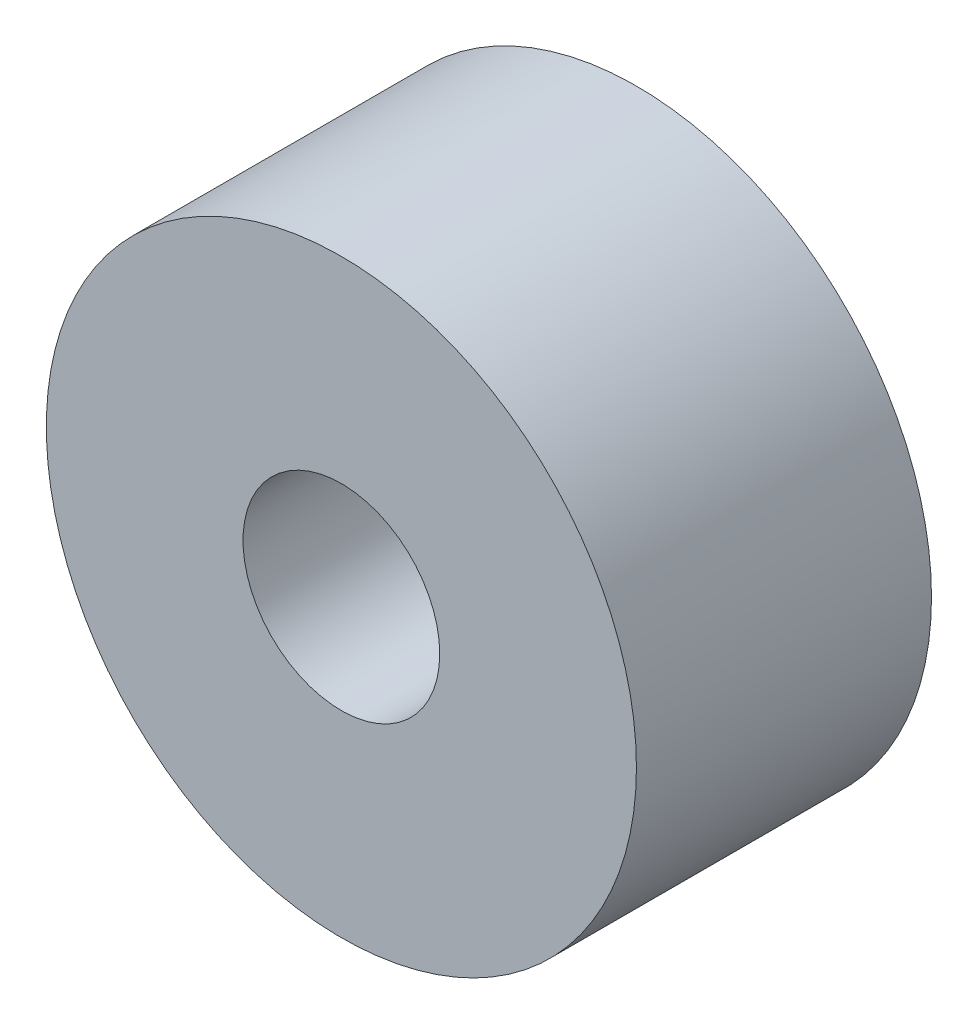
ISO-10303-21;
HEADER;
FILE_DESCRIPTION(('STEP AP214'),'2;1');
FILE_NAME('part.step','',(''),(''),'','','');
FILE_SCHEMA(('AUTOMOTIVE_DESIGN { 1 0 10303 214 1 1 1 1 }'));
ENDSEC;
DATA;
#1=APPLICATION_CONTEXT('core data for automotive mechanical design processes');
#2=APPLICATION_PROTOCOL_DEFINITION('international standard','automotive_design',2000,#1);
#3=PRODUCT_CONTEXT('',#1,'mechanical');
#4=PRODUCT('Part','Part','',(#3));
#5=PRODUCT_RELATED_PRODUCT_CATEGORY('part','',(#4));
#6=PRODUCT_DEFINITION_FORMATION('','',#4);
#7=PRODUCT_DEFINITION_CONTEXT('part definition',#1,'design');
#8=PRODUCT_DEFINITION('design','',#6,#7);
#9=PRODUCT_DEFINITION_SHAPE('','',#8);
#10=(LENGTH_UNIT() NAMED_UNIT(*) SI_UNIT(.MILLI.,.METRE.));
#11=(NAMED_UNIT(*) PLANE_ANGLE_UNIT() SI_UNIT($,.RADIAN.));
#12=(NAMED_UNIT(*) SI_UNIT($,.STERADIAN.) SOLID_ANGLE_UNIT());
#13=UNCERTAINTY_MEASURE_WITH_UNIT(LENGTH_MEASURE(1.E-05),#10,'distance_accuracy_value','');
#14=(GEOMETRIC_REPRESENTATION_CONTEXT(3) GLOBAL_UNCERTAINTY_ASSIGNED_CONTEXT((#13)) GLOBAL_UNIT_ASSIGNED_CONTEXT((#10,
#11,#12)) REPRESENTATION_CONTEXT('',''));
#15=CARTESIAN_POINT('',(0.,0.,0.));
#16=DIRECTION('',(0.,0.,1.));
#17=DIRECTION('',(1.,0.,0.));
#18=AXIS2_PLACEMENT_3D('',#15,#16,#17);
#19=CARTESIAN_POINT('',(0.,0.,3.));
#20=DIRECTION('',(0.,0.,1.));
#21=DIRECTION('',(1.,0.,0.));
#22=AXIS2_PLACEMENT_3D('',#19,#20,#21);
#23=PLANE('',#22);
#24=CARTESIAN_POINT('',(0.,0.,3.));
#25=DIRECTION('',(0.,0.,1.));
#26=DIRECTION('',(1.,0.,0.));
#27=AXIS2_PLACEMENT_3D('',#24,#25,#26);
#28=CIRCLE('',#27,3.);
#29=CARTESIAN_POINT('',(3.,0.,3.));
#30=VERTEX_POINT('',#29);
#31=EDGE_CURVE('E10',#30,#30,#28,.T.);
#32=ORIENTED_EDGE('',*,*,#31,.T.);
#33=EDGE_LOOP('',(#32));
#34=FACE_BOUND('',#33,.T.);
#35=CARTESIAN_POINT('',(0.,0.,3.));
#36=DIRECTION('',(0.,0.,1.));
#37=DIRECTION('',(1.,0.,0.));
#38=AXIS2_PLACEMENT_3D('',#35,#36,#37);
#39=CIRCLE('',#38,1.);
#40=CARTESIAN_POINT('',(1.,0.,3.));
#41=VERTEX_POINT('',#40);
#42=EDGE_CURVE('E48',#41,#41,#39,.T.);
#43=ORIENTED_EDGE('',*,*,#42,.F.);
#44=EDGE_LOOP('',(#43));
#45=FACE_BOUND('',#44,.T.);
#46=ADVANCED_FACE('F37',(#34,#45),#23,.T.);
#47=CARTESIAN_POINT('',(0.,0.,0.));
#48=DIRECTION('',(0.,0.,1.));
#49=DIRECTION('',(1.,0.,0.));
#50=AXIS2_PLACEMENT_3D('',#47,#48,#49);
#51=PLANE('',#50);
#52=CARTESIAN_POINT('',(0.,0.,0.));
#53=DIRECTION('',(0.,0.,1.));
#54=DIRECTION('',(1.,0.,0.));
#55=AXIS2_PLACEMENT_3D('',#52,#53,#54);
#56=CIRCLE('',#55,3.);
#57=CARTESIAN_POINT('',(3.,0.,0.));
#58=VERTEX_POINT('',#57);
#59=EDGE_CURVE('E41',#58,#58,#56,.T.);
#60=ORIENTED_EDGE('',*,*,#59,.F.);
#61=EDGE_LOOP('',(#60));
#62=FACE_BOUND('',#61,.T.);
#63=CARTESIAN_POINT('',(0.,0.,0.));
#64=DIRECTION('',(0.,0.,1.));
#65=DIRECTION('',(1.,0.,0.));
#66=AXIS2_PLACEMENT_3D('',#63,#64,#65);
#67=CIRCLE('',#66,1.);
#68=CARTESIAN_POINT('',(1.,0.,0.));
#69=VERTEX_POINT('',#68);
#70=EDGE_CURVE('E50',#69,#69,#67,.T.);
#71=ORIENTED_EDGE('',*,*,#70,.T.);
#72=EDGE_LOOP('',(#71));
#73=FACE_BOUND('',#72,.T.);
#74=ADVANCED_FACE('F60',(#62,#73),#51,.F.);
#75=CARTESIAN_POINT('',(0.,0.,3.));
#76=DIRECTION('',(0.,0.,-1.));
#77=DIRECTION('',(-1.,0.,0.));
#78=AXIS2_PLACEMENT_3D('',#75,#76,#77);
#79=CYLINDRICAL_SURFACE('',#78,3.);
#80=ORIENTED_EDGE('',*,*,#31,.F.);
#81=EDGE_LOOP('',(#80));
#82=FACE_BOUND('',#81,.T.);
#83=ORIENTED_EDGE('',*,*,#59,.T.);
#84=EDGE_LOOP('',(#83));
#85=FACE_BOUND('',#84,.T.);
#86=ADVANCED_FACE('F39',(#82,#85),#79,.T.);
#87=CARTESIAN_POINT('',(0.,0.,3.));
#88=DIRECTION('',(0.,0.,-1.));
#89=DIRECTION('',(-1.,0.,0.));
#90=AXIS2_PLACEMENT_3D('',#87,#88,#89);
#91=CYLINDRICAL_SURFACE('',#90,1.);
#92=ORIENTED_EDGE('',*,*,#42,.T.);
#93=EDGE_LOOP('',(#92));
#94=FACE_BOUND('',#93,.T.);
#95=ORIENTED_EDGE('',*,*,#70,.F.);
#96=EDGE_LOOP('',(#95));
#97=FACE_BOUND('',#96,.T.);
#98=ADVANCED_FACE('F56',(#94,#97),#91,.F.);
#99=CLOSED_SHELL('',(#46,#74,#86,#98));
#100=MANIFOLD_SOLID_BREP('B2',#99);
#101=ADVANCED_BREP_SHAPE_REPRESENTATION('',(#18,#100),#14);
#102=SHAPE_DEFINITION_REPRESENTATION(#9,#101);
ENDSEC;
END-ISO-10303-21;
